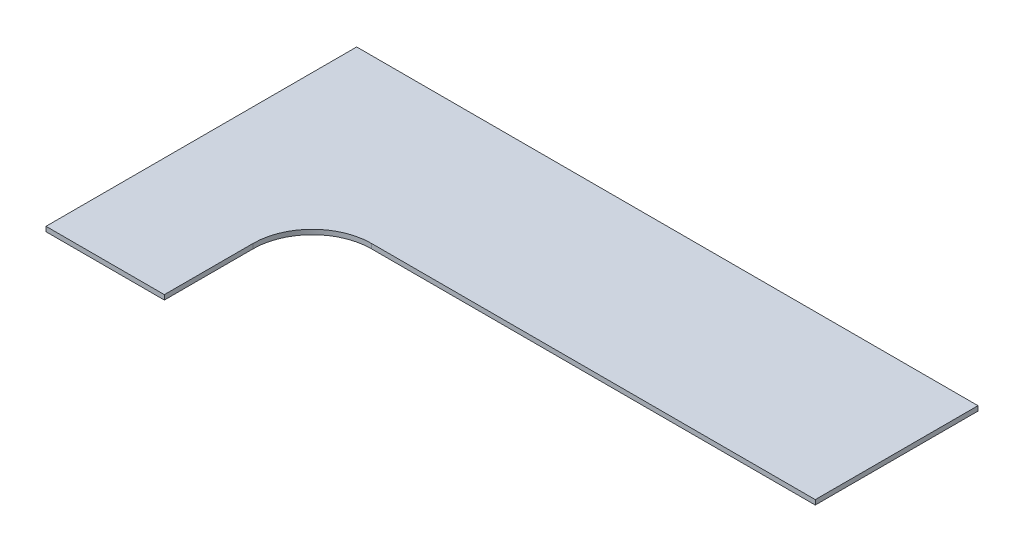
ISO-10303-21;
HEADER;
FILE_DESCRIPTION(('STEP AP214'),'2;1');
FILE_NAME('part.step','',(''),(''),'','','');
FILE_SCHEMA(('AUTOMOTIVE_DESIGN { 1 0 10303 214 1 1 1 1 }'));
ENDSEC;
DATA;
#1=APPLICATION_CONTEXT('core data for automotive mechanical design processes');
#2=APPLICATION_PROTOCOL_DEFINITION('international standard','automotive_design',2000,#1);
#3=PRODUCT_CONTEXT('',#1,'mechanical');
#4=PRODUCT('Part','Part','',(#3));
#5=PRODUCT_RELATED_PRODUCT_CATEGORY('part','',(#4));
#6=PRODUCT_DEFINITION_FORMATION('','',#4);
#7=PRODUCT_DEFINITION_CONTEXT('part definition',#1,'design');
#8=PRODUCT_DEFINITION('design','',#6,#7);
#9=PRODUCT_DEFINITION_SHAPE('','',#8);
#10=(LENGTH_UNIT() NAMED_UNIT(*) SI_UNIT(.MILLI.,.METRE.));
#11=(NAMED_UNIT(*) PLANE_ANGLE_UNIT() SI_UNIT($,.RADIAN.));
#12=(NAMED_UNIT(*) SI_UNIT($,.STERADIAN.) SOLID_ANGLE_UNIT());
#13=UNCERTAINTY_MEASURE_WITH_UNIT(LENGTH_MEASURE(1.E-05),#10,'distance_accuracy_value','');
#14=(GEOMETRIC_REPRESENTATION_CONTEXT(3) GLOBAL_UNCERTAINTY_ASSIGNED_CONTEXT((#13)) GLOBAL_UNIT_ASSIGNED_CONTEXT((#10,
#11,#12)) REPRESENTATION_CONTEXT('',''));
#15=CARTESIAN_POINT('',(0.,0.,0.));
#16=DIRECTION('',(0.,0.,1.));
#17=DIRECTION('',(1.,0.,0.));
#18=AXIS2_PLACEMENT_3D('',#15,#16,#17);
#19=CARTESIAN_POINT('',(0.,16.,1050.));
#20=DIRECTION('',(1.,0.,0.));
#21=DIRECTION('',(0.,0.,-1.));
#22=AXIS2_PLACEMENT_3D('',#19,#20,#21);
#23=PLANE('',#22);
#24=DIRECTION('',(0.,0.,1.));
#25=VECTOR('',#24,1.);
#26=CARTESIAN_POINT('',(0.,0.,1050.));
#27=LINE('',#26,#25);
#28=CARTESIAN_POINT('',(0.,0.,0.));
#29=VERTEX_POINT('',#28);
#30=CARTESIAN_POINT('',(0.,0.,1050.));
#31=VERTEX_POINT('',#30);
#32=EDGE_CURVE('E123',#29,#31,#27,.T.);
#33=ORIENTED_EDGE('',*,*,#32,.T.);
#34=DIRECTION('',(0.,-1.,0.));
#35=VECTOR('',#34,1.);
#36=CARTESIAN_POINT('',(0.,16.,1050.));
#37=LINE('',#36,#35);
#38=CARTESIAN_POINT('',(0.,16.,1050.));
#39=VERTEX_POINT('',#38);
#40=EDGE_CURVE('E11',#39,#31,#37,.T.);
#41=ORIENTED_EDGE('',*,*,#40,.F.);
#42=DIRECTION('',(0.,0.,1.));
#43=VECTOR('',#42,1.);
#44=CARTESIAN_POINT('',(0.,16.,1050.));
#45=LINE('',#44,#43);
#46=CARTESIAN_POINT('',(0.,16.,0.));
#47=VERTEX_POINT('',#46);
#48=EDGE_CURVE('E135',#47,#39,#45,.T.);
#49=ORIENTED_EDGE('',*,*,#48,.F.);
#50=DIRECTION('',(0.,-1.,0.));
#51=VECTOR('',#50,1.);
#52=CARTESIAN_POINT('',(0.,16.,0.));
#53=LINE('',#52,#51);
#54=EDGE_CURVE('E119',#47,#29,#53,.T.);
#55=ORIENTED_EDGE('',*,*,#54,.T.);
#56=EDGE_LOOP('',(#33,#41,#49,#55));
#57=FACE_BOUND('',#56,.T.);
#58=ADVANCED_FACE('F33',(#57),#23,.F.);
#59=CARTESIAN_POINT('',(400.,16.,1050.));
#60=DIRECTION('',(0.,0.,-1.));
#61=DIRECTION('',(-1.,0.,0.));
#62=AXIS2_PLACEMENT_3D('',#59,#60,#61);
#63=PLANE('',#62);
#64=DIRECTION('',(1.,0.,0.));
#65=VECTOR('',#64,1.);
#66=CARTESIAN_POINT('',(400.,0.,1050.));
#67=LINE('',#66,#65);
#68=CARTESIAN_POINT('',(400.,0.,1050.));
#69=VERTEX_POINT('',#68);
#70=EDGE_CURVE('E126',#31,#69,#67,.T.);
#71=ORIENTED_EDGE('',*,*,#70,.T.);
#72=DIRECTION('',(0.,-1.,0.));
#73=VECTOR('',#72,1.);
#74=CARTESIAN_POINT('',(400.,16.,1050.));
#75=LINE('',#74,#73);
#76=CARTESIAN_POINT('',(400.,16.,1050.));
#77=VERTEX_POINT('',#76);
#78=EDGE_CURVE('E41',#77,#69,#75,.T.);
#79=ORIENTED_EDGE('',*,*,#78,.F.);
#80=DIRECTION('',(1.,0.,0.));
#81=VECTOR('',#80,1.);
#82=CARTESIAN_POINT('',(400.,16.,1050.));
#83=LINE('',#82,#81);
#84=EDGE_CURVE('E89',#39,#77,#83,.T.);
#85=ORIENTED_EDGE('',*,*,#84,.F.);
#86=ORIENTED_EDGE('',*,*,#40,.T.);
#87=EDGE_LOOP('',(#71,#79,#85,#86));
#88=FACE_BOUND('',#87,.T.);
#89=ADVANCED_FACE('F160',(#88),#63,.F.);
#90=CARTESIAN_POINT('',(400.,16.,750.));
#91=DIRECTION('',(-1.,0.,0.));
#92=DIRECTION('',(0.,0.,1.));
#93=AXIS2_PLACEMENT_3D('',#90,#91,#92);
#94=PLANE('',#93);
#95=DIRECTION('',(0.,0.,-1.));
#96=VECTOR('',#95,1.);
#97=CARTESIAN_POINT('',(400.,0.,750.));
#98=LINE('',#97,#96);
#99=CARTESIAN_POINT('',(400.,0.,750.));
#100=VERTEX_POINT('',#99);
#101=EDGE_CURVE('E128',#69,#100,#98,.T.);
#102=ORIENTED_EDGE('',*,*,#101,.T.);
#103=DIRECTION('',(0.,-1.,0.));
#104=VECTOR('',#103,1.);
#105=CARTESIAN_POINT('',(400.,16.,750.));
#106=LINE('',#105,#104);
#107=CARTESIAN_POINT('',(400.,16.,750.));
#108=VERTEX_POINT('',#107);
#109=EDGE_CURVE('E139',#108,#100,#106,.T.);
#110=ORIENTED_EDGE('',*,*,#109,.F.);
#111=DIRECTION('',(0.,0.,-1.));
#112=VECTOR('',#111,1.);
#113=CARTESIAN_POINT('',(400.,16.,750.));
#114=LINE('',#113,#112);
#115=EDGE_CURVE('E147',#77,#108,#114,.T.);
#116=ORIENTED_EDGE('',*,*,#115,.F.);
#117=ORIENTED_EDGE('',*,*,#78,.T.);
#118=EDGE_LOOP('',(#102,#110,#116,#117));
#119=FACE_BOUND('',#118,.T.);
#120=ADVANCED_FACE('F145',(#119),#94,.F.);
#121=CARTESIAN_POINT('',(600.,16.,750.));
#122=DIRECTION('',(0.,-1.,0.));
#123=DIRECTION('',(0.,0.,-1.));
#124=AXIS2_PLACEMENT_3D('',#121,#122,#123);
#125=CYLINDRICAL_SURFACE('',#124,200.);
#126=CARTESIAN_POINT('',(600.,0.,750.));
#127=DIRECTION('',(0.,-1.,0.));
#128=DIRECTION('',(0.,0.,1.));
#129=AXIS2_PLACEMENT_3D('',#126,#127,#128);
#130=CIRCLE('',#129,200.);
#131=CARTESIAN_POINT('',(600.,0.,550.));
#132=VERTEX_POINT('',#131);
#133=EDGE_CURVE('E130',#100,#132,#130,.T.);
#134=ORIENTED_EDGE('',*,*,#133,.T.);
#135=DIRECTION('',(0.,-1.,0.));
#136=VECTOR('',#135,1.);
#137=CARTESIAN_POINT('',(600.,16.,550.));
#138=LINE('',#137,#136);
#139=CARTESIAN_POINT('',(600.,16.,550.));
#140=VERTEX_POINT('',#139);
#141=EDGE_CURVE('E114',#140,#132,#138,.T.);
#142=ORIENTED_EDGE('',*,*,#141,.F.);
#143=CARTESIAN_POINT('',(600.,16.,750.));
#144=DIRECTION('',(0.,-1.,0.));
#145=DIRECTION('',(0.,0.,1.));
#146=AXIS2_PLACEMENT_3D('',#143,#144,#145);
#147=CIRCLE('',#146,200.);
#148=EDGE_CURVE('E105',#108,#140,#147,.T.);
#149=ORIENTED_EDGE('',*,*,#148,.F.);
#150=ORIENTED_EDGE('',*,*,#109,.T.);
#151=EDGE_LOOP('',(#134,#142,#149,#150));
#152=FACE_BOUND('',#151,.T.);
#153=ADVANCED_FACE('F153',(#152),#125,.F.);
#154=CARTESIAN_POINT('',(2100.,16.,550.));
#155=DIRECTION('',(0.,0.,-1.));
#156=DIRECTION('',(-1.,0.,0.));
#157=AXIS2_PLACEMENT_3D('',#154,#155,#156);
#158=PLANE('',#157);
#159=DIRECTION('',(1.,0.,0.));
#160=VECTOR('',#159,1.);
#161=CARTESIAN_POINT('',(2100.,0.,550.));
#162=LINE('',#161,#160);
#163=CARTESIAN_POINT('',(2100.,0.,550.));
#164=VERTEX_POINT('',#163);
#165=EDGE_CURVE('E113',#132,#164,#162,.T.);
#166=ORIENTED_EDGE('',*,*,#165,.T.);
#167=DIRECTION('',(0.,-1.,0.));
#168=VECTOR('',#167,1.);
#169=CARTESIAN_POINT('',(2100.,16.,550.));
#170=LINE('',#169,#168);
#171=CARTESIAN_POINT('',(2100.,16.,550.));
#172=VERTEX_POINT('',#171);
#173=EDGE_CURVE('E110',#172,#164,#170,.T.);
#174=ORIENTED_EDGE('',*,*,#173,.F.);
#175=DIRECTION('',(1.,0.,0.));
#176=VECTOR('',#175,1.);
#177=CARTESIAN_POINT('',(2100.,16.,550.));
#178=LINE('',#177,#176);
#179=EDGE_CURVE('E99',#140,#172,#178,.T.);
#180=ORIENTED_EDGE('',*,*,#179,.F.);
#181=ORIENTED_EDGE('',*,*,#141,.T.);
#182=EDGE_LOOP('',(#166,#174,#180,#181));
#183=FACE_BOUND('',#182,.T.);
#184=ADVANCED_FACE('F111',(#183),#158,.F.);
#185=CARTESIAN_POINT('',(2100.,16.,0.));
#186=DIRECTION('',(-1.,0.,0.));
#187=DIRECTION('',(0.,0.,1.));
#188=AXIS2_PLACEMENT_3D('',#185,#186,#187);
#189=PLANE('',#188);
#190=DIRECTION('',(0.,0.,-1.));
#191=VECTOR('',#190,1.);
#192=CARTESIAN_POINT('',(2100.,0.,0.));
#193=LINE('',#192,#191);
#194=CARTESIAN_POINT('',(2100.,0.,0.));
#195=VERTEX_POINT('',#194);
#196=EDGE_CURVE('E75',#164,#195,#193,.T.);
#197=ORIENTED_EDGE('',*,*,#196,.T.);
#198=DIRECTION('',(0.,-1.,0.));
#199=VECTOR('',#198,1.);
#200=CARTESIAN_POINT('',(2100.,16.,0.));
#201=LINE('',#200,#199);
#202=CARTESIAN_POINT('',(2100.,16.,0.));
#203=VERTEX_POINT('',#202);
#204=EDGE_CURVE('E115',#203,#195,#201,.T.);
#205=ORIENTED_EDGE('',*,*,#204,.F.);
#206=DIRECTION('',(0.,0.,-1.));
#207=VECTOR('',#206,1.);
#208=CARTESIAN_POINT('',(2100.,16.,0.));
#209=LINE('',#208,#207);
#210=EDGE_CURVE('E103',#172,#203,#209,.T.);
#211=ORIENTED_EDGE('',*,*,#210,.F.);
#212=ORIENTED_EDGE('',*,*,#173,.T.);
#213=EDGE_LOOP('',(#197,#205,#211,#212));
#214=FACE_BOUND('',#213,.T.);
#215=ADVANCED_FACE('F117',(#214),#189,.F.);
#216=CARTESIAN_POINT('',(0.,16.,0.));
#217=DIRECTION('',(0.,0.,1.));
#218=DIRECTION('',(1.,0.,0.));
#219=AXIS2_PLACEMENT_3D('',#216,#217,#218);
#220=PLANE('',#219);
#221=DIRECTION('',(-1.,0.,0.));
#222=VECTOR('',#221,1.);
#223=CARTESIAN_POINT('',(0.,0.,0.));
#224=LINE('',#223,#222);
#225=EDGE_CURVE('E81',#195,#29,#224,.T.);
#226=ORIENTED_EDGE('',*,*,#225,.T.);
#227=ORIENTED_EDGE('',*,*,#54,.F.);
#228=DIRECTION('',(-1.,0.,0.));
#229=VECTOR('',#228,1.);
#230=CARTESIAN_POINT('',(0.,16.,0.));
#231=LINE('',#230,#229);
#232=EDGE_CURVE('E49',#203,#47,#231,.T.);
#233=ORIENTED_EDGE('',*,*,#232,.F.);
#234=ORIENTED_EDGE('',*,*,#204,.T.);
#235=EDGE_LOOP('',(#226,#227,#233,#234));
#236=FACE_BOUND('',#235,.T.);
#237=ADVANCED_FACE('F174',(#236),#220,.F.);
#238=CARTESIAN_POINT('',(600.,16.,750.));
#239=DIRECTION('',(0.,1.,0.));
#240=DIRECTION('',(0.,0.,1.));
#241=AXIS2_PLACEMENT_3D('',#238,#239,#240);
#242=PLANE('',#241);
#243=ORIENTED_EDGE('',*,*,#48,.T.);
#244=ORIENTED_EDGE('',*,*,#84,.T.);
#245=ORIENTED_EDGE('',*,*,#115,.T.);
#246=ORIENTED_EDGE('',*,*,#148,.T.);
#247=ORIENTED_EDGE('',*,*,#179,.T.);
#248=ORIENTED_EDGE('',*,*,#210,.T.);
#249=ORIENTED_EDGE('',*,*,#232,.T.);
#250=EDGE_LOOP('',(#243,#244,#245,#246,#247,#248,#249));
#251=FACE_BOUND('',#250,.T.);
#252=ADVANCED_FACE('F101',(#251),#242,.T.);
#253=CARTESIAN_POINT('',(600.,0.,750.));
#254=DIRECTION('',(0.,1.,0.));
#255=DIRECTION('',(0.,0.,1.));
#256=AXIS2_PLACEMENT_3D('',#253,#254,#255);
#257=PLANE('',#256);
#258=ORIENTED_EDGE('',*,*,#32,.F.);
#259=ORIENTED_EDGE('',*,*,#225,.F.);
#260=ORIENTED_EDGE('',*,*,#196,.F.);
#261=ORIENTED_EDGE('',*,*,#165,.F.);
#262=ORIENTED_EDGE('',*,*,#133,.F.);
#263=ORIENTED_EDGE('',*,*,#101,.F.);
#264=ORIENTED_EDGE('',*,*,#70,.F.);
#265=EDGE_LOOP('',(#258,#259,#260,#261,#262,#263,#264));
#266=FACE_BOUND('',#265,.T.);
#267=ADVANCED_FACE('F151',(#266),#257,.F.);
#268=CLOSED_SHELL('',(#58,#89,#120,#153,#184,#215,#237,#252,#267));
#269=MANIFOLD_SOLID_BREP('B2',#268);
#270=ADVANCED_BREP_SHAPE_REPRESENTATION('',(#18,#269),#14);
#271=SHAPE_DEFINITION_REPRESENTATION(#9,#270);
ENDSEC;
END-ISO-10303-21;
